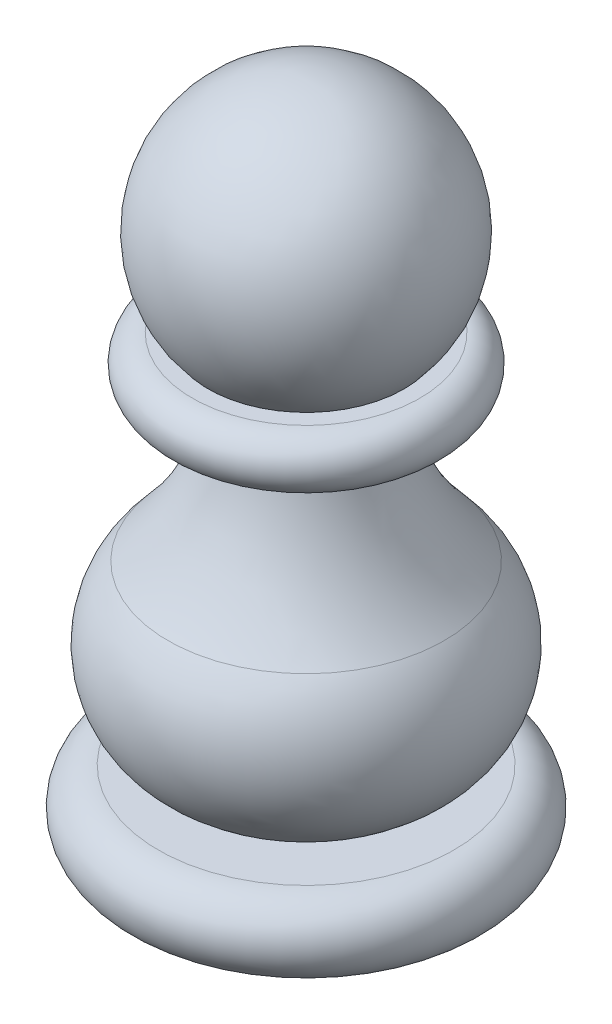
ISO-10303-21;
HEADER;
FILE_DESCRIPTION(('STEP AP214'),'2;1');
FILE_NAME('part.step','',(''),(''),'','','');
FILE_SCHEMA(('AUTOMOTIVE_DESIGN { 1 0 10303 214 1 1 1 1 }'));
ENDSEC;
DATA;
#1=APPLICATION_CONTEXT('core data for automotive mechanical design processes');
#2=APPLICATION_PROTOCOL_DEFINITION('international standard','automotive_design',2000,#1);
#3=PRODUCT_CONTEXT('',#1,'mechanical');
#4=PRODUCT('Part','Part','',(#3));
#5=PRODUCT_RELATED_PRODUCT_CATEGORY('part','',(#4));
#6=PRODUCT_DEFINITION_FORMATION('','',#4);
#7=PRODUCT_DEFINITION_CONTEXT('part definition',#1,'design');
#8=PRODUCT_DEFINITION('design','',#6,#7);
#9=PRODUCT_DEFINITION_SHAPE('','',#8);
#10=(LENGTH_UNIT() NAMED_UNIT(*) SI_UNIT(.MILLI.,.METRE.));
#11=(NAMED_UNIT(*) PLANE_ANGLE_UNIT() SI_UNIT($,.RADIAN.));
#12=(NAMED_UNIT(*) SI_UNIT($,.STERADIAN.) SOLID_ANGLE_UNIT());
#13=UNCERTAINTY_MEASURE_WITH_UNIT(LENGTH_MEASURE(1.E-05),#10,'distance_accuracy_value','');
#14=(GEOMETRIC_REPRESENTATION_CONTEXT(3) GLOBAL_UNCERTAINTY_ASSIGNED_CONTEXT((#13)) GLOBAL_UNIT_ASSIGNED_CONTEXT((#10,
#11,#12)) REPRESENTATION_CONTEXT('',''));
#15=CARTESIAN_POINT('',(0.,0.,0.));
#16=DIRECTION('',(0.,0.,1.));
#17=DIRECTION('',(1.,0.,0.));
#18=AXIS2_PLACEMENT_3D('',#15,#16,#17);
#19=CARTESIAN_POINT('',(0.,30.5,0.));
#20=DIRECTION('',(0.,-1.,0.));
#21=DIRECTION('',(1.,0.,0.));
#22=AXIS2_PLACEMENT_3D('',#19,#20,#21);
#23=SPHERICAL_SURFACE('',#22,7.5);
#24=CARTESIAN_POINT('',(0.,25.5,0.));
#25=DIRECTION('',(0.,-1.,0.));
#26=DIRECTION('',(0.,0.,-1.));
#27=AXIS2_PLACEMENT_3D('',#24,#25,#26);
#28=CIRCLE('',#27,5.59016994374947);
#29=CARTESIAN_POINT('',(0.,25.5,-5.59016994374947));
#30=VERTEX_POINT('',#29);
#31=EDGE_CURVE('E10',#30,#30,#28,.T.);
#32=ORIENTED_EDGE('',*,*,#31,.F.);
#33=EDGE_LOOP('',(#32));
#34=FACE_BOUND('',#33,.T.);
#35=ADVANCED_FACE('F43',(#34),#23,.T.);
#36=CARTESIAN_POINT('',(-5.59016994374947,25.5,0.));
#37=DIRECTION('',(0.,-1.,0.));
#38=DIRECTION('',(0.,0.,-1.));
#39=AXIS2_PLACEMENT_3D('',#36,#37,#38);
#40=PLANE('',#39);
#41=CARTESIAN_POINT('',(0.,25.5,0.));
#42=DIRECTION('',(0.,-1.,0.));
#43=DIRECTION('',(0.,0.,-1.));
#44=AXIS2_PLACEMENT_3D('',#41,#42,#43);
#45=CIRCLE('',#44,6.5);
#46=CARTESIAN_POINT('',(0.,25.5,-6.5));
#47=VERTEX_POINT('',#46);
#48=EDGE_CURVE('E50',#47,#47,#45,.T.);
#49=ORIENTED_EDGE('',*,*,#48,.F.);
#50=EDGE_LOOP('',(#49));
#51=FACE_BOUND('',#50,.T.);
#52=ORIENTED_EDGE('',*,*,#31,.T.);
#53=EDGE_LOOP('',(#52));
#54=FACE_BOUND('',#53,.T.);
#55=ADVANCED_FACE('F117',(#51,#54),#40,.F.);
#56=CARTESIAN_POINT('',(0.,24.,0.));
#57=DIRECTION('',(0.,-1.,0.));
#58=DIRECTION('',(0.,0.,-1.));
#59=AXIS2_PLACEMENT_3D('',#56,#57,#58);
#60=TOROIDAL_SURFACE('',#59,6.5,1.5);
#61=CARTESIAN_POINT('',(0.,22.5,0.));
#62=DIRECTION('',(0.,-1.,0.));
#63=DIRECTION('',(0.,0.,-1.));
#64=AXIS2_PLACEMENT_3D('',#61,#62,#63);
#65=CIRCLE('',#64,6.5);
#66=CARTESIAN_POINT('',(0.,22.5,-6.5));
#67=VERTEX_POINT('',#66);
#68=EDGE_CURVE('E55',#67,#67,#65,.T.);
#69=ORIENTED_EDGE('',*,*,#68,.F.);
#70=EDGE_LOOP('',(#69));
#71=FACE_BOUND('',#70,.T.);
#72=ORIENTED_EDGE('',*,*,#48,.T.);
#73=EDGE_LOOP('',(#72));
#74=FACE_BOUND('',#73,.T.);
#75=ADVANCED_FACE('F112',(#71,#74),#60,.T.);
#76=CARTESIAN_POINT('',(-6.5,22.5,0.));
#77=DIRECTION('',(0.,1.,0.));
#78=DIRECTION('',(0.,0.,1.));
#79=AXIS2_PLACEMENT_3D('',#76,#77,#78);
#80=PLANE('',#79);
#81=CARTESIAN_POINT('',(0.,22.5,0.));
#82=DIRECTION('',(0.,-1.,0.));
#83=DIRECTION('',(0.,0.,-1.));
#84=AXIS2_PLACEMENT_3D('',#81,#82,#83);
#85=CIRCLE('',#84,4.);
#86=CARTESIAN_POINT('',(0.,22.5,-4.));
#87=VERTEX_POINT('',#86);
#88=EDGE_CURVE('E60',#87,#87,#85,.T.);
#89=ORIENTED_EDGE('',*,*,#88,.F.);
#90=EDGE_LOOP('',(#89));
#91=FACE_BOUND('',#90,.T.);
#92=ORIENTED_EDGE('',*,*,#68,.T.);
#93=EDGE_LOOP('',(#92));
#94=FACE_BOUND('',#93,.T.);
#95=ADVANCED_FACE('F106',(#91,#94),#80,.F.);
#96=CARTESIAN_POINT('',(0.,24.4172455185829,0.));
#97=DIRECTION('',(0.,-1.,0.));
#98=DIRECTION('',(0.,0.,-1.));
#99=AXIS2_PLACEMENT_3D('',#96,#97,#98);
#100=TOROIDAL_SURFACE('',#99,18.8769677562827,15.);
#101=CARTESIAN_POINT('',(0.,14.2020635723631,0.));
#102=DIRECTION('',(0.,-1.,0.));
#103=DIRECTION('',(0.,0.,-1.));
#104=AXIS2_PLACEMENT_3D('',#101,#102,#103);
#105=CIRCLE('',#104,7.8928857370321);
#106=CARTESIAN_POINT('',(0.,14.2020635723631,-7.8928857370321));
#107=VERTEX_POINT('',#106);
#108=EDGE_CURVE('E66',#107,#107,#105,.T.);
#109=ORIENTED_EDGE('',*,*,#108,.F.);
#110=EDGE_LOOP('',(#109));
#111=FACE_BOUND('',#110,.T.);
#112=ORIENTED_EDGE('',*,*,#88,.T.);
#113=EDGE_LOOP('',(#112));
#114=FACE_BOUND('',#113,.T.);
#115=ADVANCED_FACE('F100',(#111,#114),#100,.F.);
#116=CARTESIAN_POINT('',(0.,10.1159907938751,0.));
#117=DIRECTION('',(0.,-1.,0.));
#118=DIRECTION('',(0.,0.,-1.));
#119=AXIS2_PLACEMENT_3D('',#116,#117,#118);
#120=DEGENERATE_TOROIDAL_SURFACE('',#119,3.49925292933188,6.,.T.);
#121=CARTESIAN_POINT('',(0.,4.11599079387511,0.));
#122=DIRECTION('',(0.,-1.,0.));
#123=DIRECTION('',(0.,0.,-1.));
#124=AXIS2_PLACEMENT_3D('',#121,#122,#123);
#125=CIRCLE('',#124,3.49925292933188);
#126=CARTESIAN_POINT('',(0.,4.11599079387511,-3.49925292933188));
#127=VERTEX_POINT('',#126);
#128=EDGE_CURVE('E70',#127,#127,#125,.T.);
#129=ORIENTED_EDGE('',*,*,#128,.F.);
#130=EDGE_LOOP('',(#129));
#131=FACE_BOUND('',#130,.T.);
#132=ORIENTED_EDGE('',*,*,#108,.T.);
#133=EDGE_LOOP('',(#132));
#134=FACE_BOUND('',#133,.T.);
#135=ADVANCED_FACE('F94',(#131,#134),#120,.T.);
#136=CARTESIAN_POINT('',(-8.44200460306245,4.1159907938751,0.));
#137=DIRECTION('',(0.,-1.,0.));
#138=DIRECTION('',(0.,0.,-1.));
#139=AXIS2_PLACEMENT_3D('',#136,#137,#138);
#140=PLANE('',#139);
#141=CARTESIAN_POINT('',(0.,4.1159907938751,0.));
#142=DIRECTION('',(0.,-1.,0.));
#143=DIRECTION('',(0.,0.,-1.));
#144=AXIS2_PLACEMENT_3D('',#141,#142,#143);
#145=CIRCLE('',#144,8.44200460306245);
#146=CARTESIAN_POINT('',(0.,4.1159907938751,-8.44200460306245));
#147=VERTEX_POINT('',#146);
#148=EDGE_CURVE('E74',#147,#147,#145,.T.);
#149=ORIENTED_EDGE('',*,*,#148,.F.);
#150=EDGE_LOOP('',(#149));
#151=FACE_BOUND('',#150,.T.);
#152=ORIENTED_EDGE('',*,*,#128,.T.);
#153=EDGE_LOOP('',(#152));
#154=FACE_BOUND('',#153,.T.);
#155=ADVANCED_FACE('F88',(#151,#154),#140,.F.);
#156=CARTESIAN_POINT('',(0.,2.05799539693755,0.));
#157=DIRECTION('',(0.,-1.,0.));
#158=DIRECTION('',(0.,0.,-1.));
#159=AXIS2_PLACEMENT_3D('',#156,#157,#158);
#160=TOROIDAL_SURFACE('',#159,8.44200460306245,2.05799539693755);
#161=CARTESIAN_POINT('',(0.,0.,0.));
#162=DIRECTION('',(0.,-1.,0.));
#163=DIRECTION('',(0.,0.,-1.));
#164=AXIS2_PLACEMENT_3D('',#161,#162,#163);
#165=CIRCLE('',#164,8.44200460306245);
#166=CARTESIAN_POINT('',(0.,0.,-8.44200460306245));
#167=VERTEX_POINT('',#166);
#168=EDGE_CURVE('E78',#167,#167,#165,.T.);
#169=ORIENTED_EDGE('',*,*,#168,.F.);
#170=EDGE_LOOP('',(#169));
#171=FACE_BOUND('',#170,.T.);
#172=ORIENTED_EDGE('',*,*,#148,.T.);
#173=EDGE_LOOP('',(#172));
#174=FACE_BOUND('',#173,.T.);
#175=ADVANCED_FACE('F85',(#171,#174),#160,.T.);
#176=CARTESIAN_POINT('',(0.,0.,0.));
#177=DIRECTION('',(0.,1.,0.));
#178=DIRECTION('',(0.,0.,1.));
#179=AXIS2_PLACEMENT_3D('',#176,#177,#178);
#180=PLANE('',#179);
#181=ORIENTED_EDGE('',*,*,#168,.T.);
#182=EDGE_LOOP('',(#181));
#183=FACE_BOUND('',#182,.T.);
#184=ADVANCED_FACE('F83',(#183),#180,.F.);
#185=CLOSED_SHELL('',(#35,#55,#75,#95,#115,#135,#155,#175,#184));
#186=MANIFOLD_SOLID_BREP('B2',#185);
#187=ADVANCED_BREP_SHAPE_REPRESENTATION('',(#18,#186),#14);
#188=SHAPE_DEFINITION_REPRESENTATION(#9,#187);
ENDSEC;
END-ISO-10303-21;
